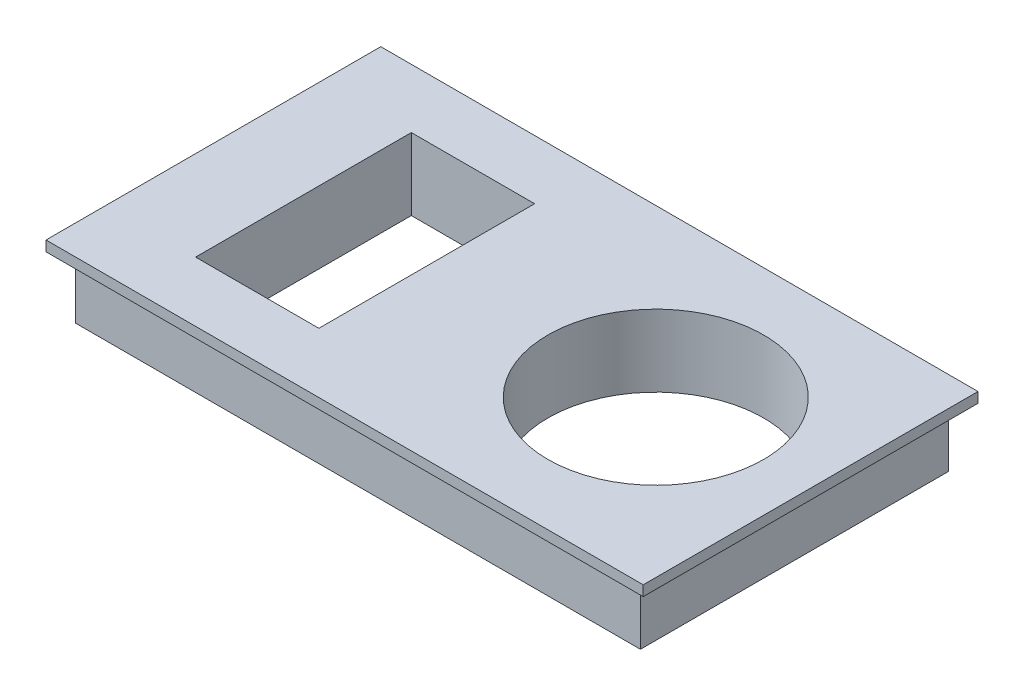
ISO-10303-21;
HEADER;
FILE_DESCRIPTION(('STEP AP214'),'2;1');
FILE_NAME('part.step','',(''),(''),'','','');
FILE_SCHEMA(('AUTOMOTIVE_DESIGN { 1 0 10303 214 1 1 1 1 }'));
ENDSEC;
DATA;
#1=APPLICATION_CONTEXT('core data for automotive mechanical design processes');
#2=APPLICATION_PROTOCOL_DEFINITION('international standard','automotive_design',2000,#1);
#3=PRODUCT_CONTEXT('',#1,'mechanical');
#4=PRODUCT('Part','Part','',(#3));
#5=PRODUCT_RELATED_PRODUCT_CATEGORY('part','',(#4));
#6=PRODUCT_DEFINITION_FORMATION('','',#4);
#7=PRODUCT_DEFINITION_CONTEXT('part definition',#1,'design');
#8=PRODUCT_DEFINITION('design','',#6,#7);
#9=PRODUCT_DEFINITION_SHAPE('','',#8);
#10=(LENGTH_UNIT() NAMED_UNIT(*) SI_UNIT(.MILLI.,.METRE.));
#11=(NAMED_UNIT(*) PLANE_ANGLE_UNIT() SI_UNIT($,.RADIAN.));
#12=(NAMED_UNIT(*) SI_UNIT($,.STERADIAN.) SOLID_ANGLE_UNIT());
#13=UNCERTAINTY_MEASURE_WITH_UNIT(LENGTH_MEASURE(1.E-05),#10,'distance_accuracy_value','');
#14=(GEOMETRIC_REPRESENTATION_CONTEXT(3) GLOBAL_UNCERTAINTY_ASSIGNED_CONTEXT((#13)) GLOBAL_UNIT_ASSIGNED_CONTEXT((#10,
#11,#12)) REPRESENTATION_CONTEXT('',''));
#15=CARTESIAN_POINT('',(0.,0.,0.));
#16=DIRECTION('',(0.,0.,1.));
#17=DIRECTION('',(1.,0.,0.));
#18=AXIS2_PLACEMENT_3D('',#15,#16,#17);
#19=CARTESIAN_POINT('',(0.,-7.,-15.));
#20=DIRECTION('',(0.,0.,-1.));
#21=DIRECTION('',(-1.,0.,0.));
#22=AXIS2_PLACEMENT_3D('',#19,#20,#21);
#23=PLANE('',#22);
#24=DIRECTION('',(0.,1.,0.));
#25=VECTOR('',#24,1.);
#26=CARTESIAN_POINT('',(-27.5,-7.,-15.));
#27=LINE('',#26,#25);
#28=CARTESIAN_POINT('',(-27.5,-7.,-15.));
#29=VERTEX_POINT('',#28);
#30=CARTESIAN_POINT('',(-27.5,-1.,-15.));
#31=VERTEX_POINT('',#30);
#32=EDGE_CURVE('E41',#29,#31,#27,.T.);
#33=ORIENTED_EDGE('',*,*,#32,.T.);
#34=DIRECTION('',(-1.,0.,0.));
#35=VECTOR('',#34,1.);
#36=CARTESIAN_POINT('',(0.,-1.,-15.));
#37=LINE('',#36,#35);
#38=CARTESIAN_POINT('',(27.5,-1.,-15.));
#39=VERTEX_POINT('',#38);
#40=EDGE_CURVE('E54',#39,#31,#37,.T.);
#41=ORIENTED_EDGE('',*,*,#40,.F.);
#42=DIRECTION('',(0.,1.,0.));
#43=VECTOR('',#42,1.);
#44=CARTESIAN_POINT('',(27.5,-7.,-15.));
#45=LINE('',#44,#43);
#46=CARTESIAN_POINT('',(27.5,-7.,-15.));
#47=VERTEX_POINT('',#46);
#48=EDGE_CURVE('E150',#47,#39,#45,.T.);
#49=ORIENTED_EDGE('',*,*,#48,.F.);
#50=DIRECTION('',(-1.,0.,0.));
#51=VECTOR('',#50,1.);
#52=CARTESIAN_POINT('',(0.,-7.,-15.));
#53=LINE('',#52,#51);
#54=EDGE_CURVE('E163',#47,#29,#53,.T.);
#55=ORIENTED_EDGE('',*,*,#54,.T.);
#56=EDGE_LOOP('',(#33,#41,#49,#55));
#57=FACE_BOUND('',#56,.T.);
#58=ADVANCED_FACE('F37',(#57),#23,.T.);
#59=CARTESIAN_POINT('',(27.5,-7.,0.));
#60=DIRECTION('',(-1.,0.,0.));
#61=DIRECTION('',(0.,0.,1.));
#62=AXIS2_PLACEMENT_3D('',#59,#60,#61);
#63=PLANE('',#62);
#64=DIRECTION('',(0.,0.,1.));
#65=VECTOR('',#64,1.);
#66=CARTESIAN_POINT('',(27.5,-1.,0.));
#67=LINE('',#66,#65);
#68=CARTESIAN_POINT('',(27.5,-1.,15.));
#69=VERTEX_POINT('',#68);
#70=EDGE_CURVE('E180',#39,#69,#67,.T.);
#71=ORIENTED_EDGE('',*,*,#70,.T.);
#72=DIRECTION('',(0.,1.,0.));
#73=VECTOR('',#72,1.);
#74=CARTESIAN_POINT('',(27.5,-7.,15.));
#75=LINE('',#74,#73);
#76=CARTESIAN_POINT('',(27.5,-7.,15.));
#77=VERTEX_POINT('',#76);
#78=EDGE_CURVE('E153',#77,#69,#75,.T.);
#79=ORIENTED_EDGE('',*,*,#78,.F.);
#80=DIRECTION('',(0.,0.,1.));
#81=VECTOR('',#80,1.);
#82=CARTESIAN_POINT('',(27.5,-7.,0.));
#83=LINE('',#82,#81);
#84=EDGE_CURVE('E130',#47,#77,#83,.T.);
#85=ORIENTED_EDGE('',*,*,#84,.F.);
#86=ORIENTED_EDGE('',*,*,#48,.T.);
#87=EDGE_LOOP('',(#71,#79,#85,#86));
#88=FACE_BOUND('',#87,.T.);
#89=ADVANCED_FACE('F178',(#88),#63,.F.);
#90=CARTESIAN_POINT('',(0.,-7.,15.));
#91=DIRECTION('',(0.,0.,-1.));
#92=DIRECTION('',(-1.,0.,0.));
#93=AXIS2_PLACEMENT_3D('',#90,#91,#92);
#94=PLANE('',#93);
#95=DIRECTION('',(-1.,0.,0.));
#96=VECTOR('',#95,1.);
#97=CARTESIAN_POINT('',(0.,-1.,15.));
#98=LINE('',#97,#96);
#99=CARTESIAN_POINT('',(-27.5,-1.,15.));
#100=VERTEX_POINT('',#99);
#101=EDGE_CURVE('E185',#69,#100,#98,.T.);
#102=ORIENTED_EDGE('',*,*,#101,.T.);
#103=DIRECTION('',(0.,1.,0.));
#104=VECTOR('',#103,1.);
#105=CARTESIAN_POINT('',(-27.5,-7.,15.));
#106=LINE('',#105,#104);
#107=CARTESIAN_POINT('',(-27.5,-7.,15.));
#108=VERTEX_POINT('',#107);
#109=EDGE_CURVE('E155',#108,#100,#106,.T.);
#110=ORIENTED_EDGE('',*,*,#109,.F.);
#111=DIRECTION('',(-1.,0.,0.));
#112=VECTOR('',#111,1.);
#113=CARTESIAN_POINT('',(0.,-7.,15.));
#114=LINE('',#113,#112);
#115=EDGE_CURVE('E169',#77,#108,#114,.T.);
#116=ORIENTED_EDGE('',*,*,#115,.F.);
#117=ORIENTED_EDGE('',*,*,#78,.T.);
#118=EDGE_LOOP('',(#102,#110,#116,#117));
#119=FACE_BOUND('',#118,.T.);
#120=ADVANCED_FACE('F183',(#119),#94,.F.);
#121=CARTESIAN_POINT('',(-27.5,-7.,0.));
#122=DIRECTION('',(-1.,0.,0.));
#123=DIRECTION('',(0.,0.,1.));
#124=AXIS2_PLACEMENT_3D('',#121,#122,#123);
#125=PLANE('',#124);
#126=ORIENTED_EDGE('',*,*,#109,.T.);
#127=DIRECTION('',(0.,0.,1.));
#128=VECTOR('',#127,1.);
#129=CARTESIAN_POINT('',(-27.5,-1.,0.));
#130=LINE('',#129,#128);
#131=EDGE_CURVE('E232',#31,#100,#130,.T.);
#132=ORIENTED_EDGE('',*,*,#131,.F.);
#133=ORIENTED_EDGE('',*,*,#32,.F.);
#134=DIRECTION('',(0.,0.,1.));
#135=VECTOR('',#134,1.);
#136=CARTESIAN_POINT('',(-27.5,-7.,0.));
#137=LINE('',#136,#135);
#138=EDGE_CURVE('E167',#29,#108,#137,.T.);
#139=ORIENTED_EDGE('',*,*,#138,.T.);
#140=EDGE_LOOP('',(#126,#132,#133,#139));
#141=FACE_BOUND('',#140,.T.);
#142=ADVANCED_FACE('F260',(#141),#125,.T.);
#143=CARTESIAN_POINT('',(0.,-7.,-10.4111383112377));
#144=DIRECTION('',(0.,0.,1.));
#145=DIRECTION('',(1.,0.,0.));
#146=AXIS2_PLACEMENT_3D('',#143,#144,#145);
#147=PLANE('',#146);
#148=DIRECTION('',(1.,0.,0.));
#149=VECTOR('',#148,1.);
#150=CARTESIAN_POINT('',(0.,0.,-10.4111383112377));
#151=LINE('',#150,#149);
#152=CARTESIAN_POINT('',(-20.2127116246006,0.,-10.4111383112377));
#153=VERTEX_POINT('',#152);
#154=CARTESIAN_POINT('',(-8.21271162460061,0.,-10.4111383112377));
#155=VERTEX_POINT('',#154);
#156=EDGE_CURVE('E138',#153,#155,#151,.T.);
#157=ORIENTED_EDGE('',*,*,#156,.F.);
#158=DIRECTION('',(0.,1.,0.));
#159=VECTOR('',#158,1.);
#160=CARTESIAN_POINT('',(-20.2127116246006,-7.,-10.4111383112377));
#161=LINE('',#160,#159);
#162=CARTESIAN_POINT('',(-20.2127116246006,-7.,-10.4111383112377));
#163=VERTEX_POINT('',#162);
#164=EDGE_CURVE('E11',#163,#153,#161,.T.);
#165=ORIENTED_EDGE('',*,*,#164,.F.);
#166=DIRECTION('',(1.,0.,0.));
#167=VECTOR('',#166,1.);
#168=CARTESIAN_POINT('',(0.,-7.,-10.4111383112377));
#169=LINE('',#168,#167);
#170=CARTESIAN_POINT('',(-8.21271162460061,-7.,-10.4111383112377));
#171=VERTEX_POINT('',#170);
#172=EDGE_CURVE('E128',#163,#171,#169,.T.);
#173=ORIENTED_EDGE('',*,*,#172,.T.);
#174=DIRECTION('',(0.,1.,0.));
#175=VECTOR('',#174,1.);
#176=CARTESIAN_POINT('',(-8.21271162460061,-7.,-10.4111383112377));
#177=LINE('',#176,#175);
#178=EDGE_CURVE('E125',#171,#155,#177,.T.);
#179=ORIENTED_EDGE('',*,*,#178,.T.);
#180=EDGE_LOOP('',(#157,#165,#173,#179));
#181=FACE_BOUND('',#180,.T.);
#182=ADVANCED_FACE('F262',(#181),#147,.T.);
#183=CARTESIAN_POINT('',(-20.2127116246006,-7.,0.));
#184=DIRECTION('',(-1.,0.,0.));
#185=DIRECTION('',(0.,0.,1.));
#186=AXIS2_PLACEMENT_3D('',#183,#184,#185);
#187=PLANE('',#186);
#188=DIRECTION('',(0.,0.,1.));
#189=VECTOR('',#188,1.);
#190=CARTESIAN_POINT('',(-20.2127116246006,0.,0.));
#191=LINE('',#190,#189);
#192=CARTESIAN_POINT('',(-20.2127116246006,0.,10.5888616887623));
#193=VERTEX_POINT('',#192);
#194=EDGE_CURVE('E145',#153,#193,#191,.T.);
#195=ORIENTED_EDGE('',*,*,#194,.T.);
#196=DIRECTION('',(0.,1.,0.));
#197=VECTOR('',#196,1.);
#198=CARTESIAN_POINT('',(-20.2127116246006,-7.,10.5888616887623));
#199=LINE('',#198,#197);
#200=CARTESIAN_POINT('',(-20.2127116246006,-7.,10.5888616887623));
#201=VERTEX_POINT('',#200);
#202=EDGE_CURVE('E46',#201,#193,#199,.T.);
#203=ORIENTED_EDGE('',*,*,#202,.F.);
#204=DIRECTION('',(0.,0.,1.));
#205=VECTOR('',#204,1.);
#206=CARTESIAN_POINT('',(-20.2127116246006,-7.,0.));
#207=LINE('',#206,#205);
#208=EDGE_CURVE('E113',#163,#201,#207,.T.);
#209=ORIENTED_EDGE('',*,*,#208,.F.);
#210=ORIENTED_EDGE('',*,*,#164,.T.);
#211=EDGE_LOOP('',(#195,#203,#209,#210));
#212=FACE_BOUND('',#211,.T.);
#213=ADVANCED_FACE('F268',(#212),#187,.F.);
#214=CARTESIAN_POINT('',(0.,-7.,10.5888616887623));
#215=DIRECTION('',(0.,0.,1.));
#216=DIRECTION('',(1.,0.,0.));
#217=AXIS2_PLACEMENT_3D('',#214,#215,#216);
#218=PLANE('',#217);
#219=DIRECTION('',(1.,0.,0.));
#220=VECTOR('',#219,1.);
#221=CARTESIAN_POINT('',(0.,0.,10.5888616887623));
#222=LINE('',#221,#220);
#223=CARTESIAN_POINT('',(-8.21271162460061,0.,10.5888616887623));
#224=VERTEX_POINT('',#223);
#225=EDGE_CURVE('E121',#193,#224,#222,.T.);
#226=ORIENTED_EDGE('',*,*,#225,.T.);
#227=DIRECTION('',(0.,1.,0.));
#228=VECTOR('',#227,1.);
#229=CARTESIAN_POINT('',(-8.21271162460061,-7.,10.5888616887623));
#230=LINE('',#229,#228);
#231=CARTESIAN_POINT('',(-8.21271162460061,-7.,10.5888616887623));
#232=VERTEX_POINT('',#231);
#233=EDGE_CURVE('E119',#232,#224,#230,.T.);
#234=ORIENTED_EDGE('',*,*,#233,.F.);
#235=DIRECTION('',(1.,0.,0.));
#236=VECTOR('',#235,1.);
#237=CARTESIAN_POINT('',(0.,-7.,10.5888616887623));
#238=LINE('',#237,#236);
#239=EDGE_CURVE('E107',#201,#232,#238,.T.);
#240=ORIENTED_EDGE('',*,*,#239,.F.);
#241=ORIENTED_EDGE('',*,*,#202,.T.);
#242=EDGE_LOOP('',(#226,#234,#240,#241));
#243=FACE_BOUND('',#242,.T.);
#244=ADVANCED_FACE('F120',(#243),#218,.F.);
#245=CARTESIAN_POINT('',(13.9934157401081,-7.,0.));
#246=DIRECTION('',(0.,1.,0.));
#247=DIRECTION('',(0.,0.,1.));
#248=AXIS2_PLACEMENT_3D('',#245,#246,#247);
#249=CYLINDRICAL_SURFACE('',#248,10.5);
#250=CARTESIAN_POINT('',(13.9934157401081,-7.,0.));
#251=DIRECTION('',(0.,1.,0.));
#252=DIRECTION('',(0.,0.,1.));
#253=AXIS2_PLACEMENT_3D('',#250,#251,#252);
#254=CIRCLE('',#253,10.5);
#255=CARTESIAN_POINT('',(13.9934157401081,-7.,10.5));
#256=VERTEX_POINT('',#255);
#257=EDGE_CURVE('E146',#256,#256,#254,.T.);
#258=ORIENTED_EDGE('',*,*,#257,.F.);
#259=EDGE_LOOP('',(#258));
#260=FACE_BOUND('',#259,.T.);
#261=CARTESIAN_POINT('',(13.9934157401081,0.,0.));
#262=DIRECTION('',(0.,1.,0.));
#263=DIRECTION('',(0.,0.,1.));
#264=AXIS2_PLACEMENT_3D('',#261,#262,#263);
#265=CIRCLE('',#264,10.5);
#266=CARTESIAN_POINT('',(13.9934157401081,0.,10.5));
#267=VERTEX_POINT('',#266);
#268=EDGE_CURVE('E135',#267,#267,#265,.T.);
#269=ORIENTED_EDGE('',*,*,#268,.T.);
#270=EDGE_LOOP('',(#269));
#271=FACE_BOUND('',#270,.T.);
#272=ADVANCED_FACE('F39',(#260,#271),#249,.F.);
#273=CARTESIAN_POINT('',(-8.21271162460061,-7.,0.));
#274=DIRECTION('',(-1.,0.,0.));
#275=DIRECTION('',(0.,0.,1.));
#276=AXIS2_PLACEMENT_3D('',#273,#274,#275);
#277=PLANE('',#276);
#278=DIRECTION('',(0.,0.,1.));
#279=VECTOR('',#278,1.);
#280=CARTESIAN_POINT('',(-8.21271162460061,0.,0.));
#281=LINE('',#280,#279);
#282=EDGE_CURVE('E142',#155,#224,#281,.T.);
#283=ORIENTED_EDGE('',*,*,#282,.F.);
#284=ORIENTED_EDGE('',*,*,#178,.F.);
#285=DIRECTION('',(0.,0.,1.));
#286=VECTOR('',#285,1.);
#287=CARTESIAN_POINT('',(-8.21271162460061,-7.,0.));
#288=LINE('',#287,#286);
#289=EDGE_CURVE('E112',#171,#232,#288,.T.);
#290=ORIENTED_EDGE('',*,*,#289,.T.);
#291=ORIENTED_EDGE('',*,*,#233,.T.);
#292=EDGE_LOOP('',(#283,#284,#290,#291));
#293=FACE_BOUND('',#292,.T.);
#294=ADVANCED_FACE('F127',(#293),#277,.T.);
#295=CARTESIAN_POINT('',(0.,-7.,0.));
#296=DIRECTION('',(0.,1.,0.));
#297=DIRECTION('',(0.,0.,1.));
#298=AXIS2_PLACEMENT_3D('',#295,#296,#297);
#299=PLANE('',#298);
#300=ORIENTED_EDGE('',*,*,#257,.T.);
#301=EDGE_LOOP('',(#300));
#302=FACE_BOUND('',#301,.T.);
#303=ORIENTED_EDGE('',*,*,#54,.F.);
#304=ORIENTED_EDGE('',*,*,#84,.T.);
#305=ORIENTED_EDGE('',*,*,#115,.T.);
#306=ORIENTED_EDGE('',*,*,#138,.F.);
#307=EDGE_LOOP('',(#303,#304,#305,#306));
#308=FACE_BOUND('',#307,.T.);
#309=ORIENTED_EDGE('',*,*,#172,.F.);
#310=ORIENTED_EDGE('',*,*,#208,.T.);
#311=ORIENTED_EDGE('',*,*,#239,.T.);
#312=ORIENTED_EDGE('',*,*,#289,.F.);
#313=EDGE_LOOP('',(#309,#310,#311,#312));
#314=FACE_BOUND('',#313,.T.);
#315=ADVANCED_FACE('F110',(#302,#308,#314),#299,.F.);
#316=CARTESIAN_POINT('',(0.,0.,0.));
#317=DIRECTION('',(0.,1.,0.));
#318=DIRECTION('',(0.,0.,1.));
#319=AXIS2_PLACEMENT_3D('',#316,#317,#318);
#320=PLANE('',#319);
#321=ORIENTED_EDGE('',*,*,#268,.F.);
#322=EDGE_LOOP('',(#321));
#323=FACE_BOUND('',#322,.T.);
#324=ORIENTED_EDGE('',*,*,#156,.T.);
#325=ORIENTED_EDGE('',*,*,#282,.T.);
#326=ORIENTED_EDGE('',*,*,#225,.F.);
#327=ORIENTED_EDGE('',*,*,#194,.F.);
#328=EDGE_LOOP('',(#324,#325,#326,#327));
#329=FACE_BOUND('',#328,.T.);
#330=DIRECTION('',(-1.,0.,0.));
#331=VECTOR('',#330,1.);
#332=CARTESIAN_POINT('',(0.,0.,-16.1627700200353));
#333=LINE('',#332,#331);
#334=CARTESIAN_POINT('',(29.194356930057,0.,-16.1627700200353));
#335=VERTEX_POINT('',#334);
#336=CARTESIAN_POINT('',(-28.9376517710529,0.,-16.1627700200353));
#337=VERTEX_POINT('',#336);
#338=EDGE_CURVE('E231',#335,#337,#333,.T.);
#339=ORIENTED_EDGE('',*,*,#338,.T.);
#340=DIRECTION('',(0.,0.,1.));
#341=VECTOR('',#340,1.);
#342=CARTESIAN_POINT('',(-28.9376517710529,0.,0.));
#343=LINE('',#342,#341);
#344=CARTESIAN_POINT('',(-28.9376517710529,0.,16.4245777734));
#345=VERTEX_POINT('',#344);
#346=EDGE_CURVE('E237',#337,#345,#343,.T.);
#347=ORIENTED_EDGE('',*,*,#346,.T.);
#348=DIRECTION('',(-1.,0.,0.));
#349=VECTOR('',#348,1.);
#350=CARTESIAN_POINT('',(0.,0.,16.4245777734));
#351=LINE('',#350,#349);
#352=CARTESIAN_POINT('',(29.194356930057,0.,16.4245777734));
#353=VERTEX_POINT('',#352);
#354=EDGE_CURVE('E212',#353,#345,#351,.T.);
#355=ORIENTED_EDGE('',*,*,#354,.F.);
#356=DIRECTION('',(0.,0.,1.));
#357=VECTOR('',#356,1.);
#358=CARTESIAN_POINT('',(29.194356930057,0.,0.));
#359=LINE('',#358,#357);
#360=EDGE_CURVE('E220',#335,#353,#359,.T.);
#361=ORIENTED_EDGE('',*,*,#360,.F.);
#362=EDGE_LOOP('',(#339,#347,#355,#361));
#363=FACE_BOUND('',#362,.T.);
#364=ADVANCED_FACE('F230',(#323,#329,#363),#320,.T.);
#365=CARTESIAN_POINT('',(0.,-1.,-16.1627700200353));
#366=DIRECTION('',(0.,0.,-1.));
#367=DIRECTION('',(-1.,0.,0.));
#368=AXIS2_PLACEMENT_3D('',#365,#366,#367);
#369=PLANE('',#368);
#370=ORIENTED_EDGE('',*,*,#338,.F.);
#371=DIRECTION('',(0.,1.,0.));
#372=VECTOR('',#371,1.);
#373=CARTESIAN_POINT('',(29.194356930057,-1.,-16.1627700200353));
#374=LINE('',#373,#372);
#375=CARTESIAN_POINT('',(29.194356930057,-1.,-16.1627700200353));
#376=VERTEX_POINT('',#375);
#377=EDGE_CURVE('E139',#376,#335,#374,.T.);
#378=ORIENTED_EDGE('',*,*,#377,.F.);
#379=DIRECTION('',(-1.,0.,0.));
#380=VECTOR('',#379,1.);
#381=CARTESIAN_POINT('',(0.,-1.,-16.1627700200353));
#382=LINE('',#381,#380);
#383=CARTESIAN_POINT('',(-28.9376517710529,-1.,-16.1627700200353));
#384=VERTEX_POINT('',#383);
#385=EDGE_CURVE('E252',#376,#384,#382,.T.);
#386=ORIENTED_EDGE('',*,*,#385,.T.);
#387=DIRECTION('',(0.,1.,0.));
#388=VECTOR('',#387,1.);
#389=CARTESIAN_POINT('',(-28.9376517710529,-1.,-16.1627700200353));
#390=LINE('',#389,#388);
#391=EDGE_CURVE('E235',#384,#337,#390,.T.);
#392=ORIENTED_EDGE('',*,*,#391,.T.);
#393=EDGE_LOOP('',(#370,#378,#386,#392));
#394=FACE_BOUND('',#393,.T.);
#395=ADVANCED_FACE('F234',(#394),#369,.T.);
#396=CARTESIAN_POINT('',(29.194356930057,-1.,0.));
#397=DIRECTION('',(-1.,0.,0.));
#398=DIRECTION('',(0.,0.,1.));
#399=AXIS2_PLACEMENT_3D('',#396,#397,#398);
#400=PLANE('',#399);
#401=ORIENTED_EDGE('',*,*,#360,.T.);
#402=DIRECTION('',(0.,1.,0.));
#403=VECTOR('',#402,1.);
#404=CARTESIAN_POINT('',(29.194356930057,-1.,16.4245777734));
#405=LINE('',#404,#403);
#406=CARTESIAN_POINT('',(29.194356930057,-1.,16.4245777734));
#407=VERTEX_POINT('',#406);
#408=EDGE_CURVE('E227',#407,#353,#405,.T.);
#409=ORIENTED_EDGE('',*,*,#408,.F.);
#410=DIRECTION('',(0.,0.,1.));
#411=VECTOR('',#410,1.);
#412=CARTESIAN_POINT('',(29.194356930057,-1.,0.));
#413=LINE('',#412,#411);
#414=EDGE_CURVE('E222',#376,#407,#413,.T.);
#415=ORIENTED_EDGE('',*,*,#414,.F.);
#416=ORIENTED_EDGE('',*,*,#377,.T.);
#417=EDGE_LOOP('',(#401,#409,#415,#416));
#418=FACE_BOUND('',#417,.T.);
#419=ADVANCED_FACE('F218',(#418),#400,.F.);
#420=CARTESIAN_POINT('',(0.,-1.,16.4245777734));
#421=DIRECTION('',(0.,0.,-1.));
#422=DIRECTION('',(-1.,0.,0.));
#423=AXIS2_PLACEMENT_3D('',#420,#421,#422);
#424=PLANE('',#423);
#425=ORIENTED_EDGE('',*,*,#354,.T.);
#426=DIRECTION('',(0.,1.,0.));
#427=VECTOR('',#426,1.);
#428=CARTESIAN_POINT('',(-28.9376517710529,-1.,16.4245777734));
#429=LINE('',#428,#427);
#430=CARTESIAN_POINT('',(-28.9376517710529,-1.,16.4245777734));
#431=VERTEX_POINT('',#430);
#432=EDGE_CURVE('E245',#431,#345,#429,.T.);
#433=ORIENTED_EDGE('',*,*,#432,.F.);
#434=DIRECTION('',(-1.,0.,0.));
#435=VECTOR('',#434,1.);
#436=CARTESIAN_POINT('',(0.,-1.,16.4245777734));
#437=LINE('',#436,#435);
#438=EDGE_CURVE('E246',#407,#431,#437,.T.);
#439=ORIENTED_EDGE('',*,*,#438,.F.);
#440=ORIENTED_EDGE('',*,*,#408,.T.);
#441=EDGE_LOOP('',(#425,#433,#439,#440));
#442=FACE_BOUND('',#441,.T.);
#443=ADVANCED_FACE('F296',(#442),#424,.F.);
#444=CARTESIAN_POINT('',(-28.9376517710529,-1.,0.));
#445=DIRECTION('',(-1.,0.,0.));
#446=DIRECTION('',(0.,0.,1.));
#447=AXIS2_PLACEMENT_3D('',#444,#445,#446);
#448=PLANE('',#447);
#449=ORIENTED_EDGE('',*,*,#346,.F.);
#450=ORIENTED_EDGE('',*,*,#391,.F.);
#451=DIRECTION('',(0.,0.,1.));
#452=VECTOR('',#451,1.);
#453=CARTESIAN_POINT('',(-28.9376517710529,-1.,0.));
#454=LINE('',#453,#452);
#455=EDGE_CURVE('E248',#384,#431,#454,.T.);
#456=ORIENTED_EDGE('',*,*,#455,.T.);
#457=ORIENTED_EDGE('',*,*,#432,.T.);
#458=EDGE_LOOP('',(#449,#450,#456,#457));
#459=FACE_BOUND('',#458,.T.);
#460=ADVANCED_FACE('F293',(#459),#448,.T.);
#461=CARTESIAN_POINT('',(0.,-1.,0.));
#462=DIRECTION('',(0.,1.,0.));
#463=DIRECTION('',(0.,0.,1.));
#464=AXIS2_PLACEMENT_3D('',#461,#462,#463);
#465=PLANE('',#464);
#466=ORIENTED_EDGE('',*,*,#131,.T.);
#467=ORIENTED_EDGE('',*,*,#101,.F.);
#468=ORIENTED_EDGE('',*,*,#70,.F.);
#469=ORIENTED_EDGE('',*,*,#40,.T.);
#470=EDGE_LOOP('',(#466,#467,#468,#469));
#471=FACE_BOUND('',#470,.T.);
#472=ORIENTED_EDGE('',*,*,#385,.F.);
#473=ORIENTED_EDGE('',*,*,#414,.T.);
#474=ORIENTED_EDGE('',*,*,#438,.T.);
#475=ORIENTED_EDGE('',*,*,#455,.F.);
#476=EDGE_LOOP('',(#472,#473,#474,#475));
#477=FACE_BOUND('',#476,.T.);
#478=ADVANCED_FACE('F259',(#471,#477),#465,.F.);
#479=CLOSED_SHELL('',(#58,#89,#120,#142,#182,#213,#244,#272,#294,#315,#364,#395,#419,#443,#460,#478));
#480=MANIFOLD_SOLID_BREP('B2',#479);
#481=ADVANCED_BREP_SHAPE_REPRESENTATION('',(#18,#480),#14);
#482=SHAPE_DEFINITION_REPRESENTATION(#9,#481);
ENDSEC;
END-ISO-10303-21;
